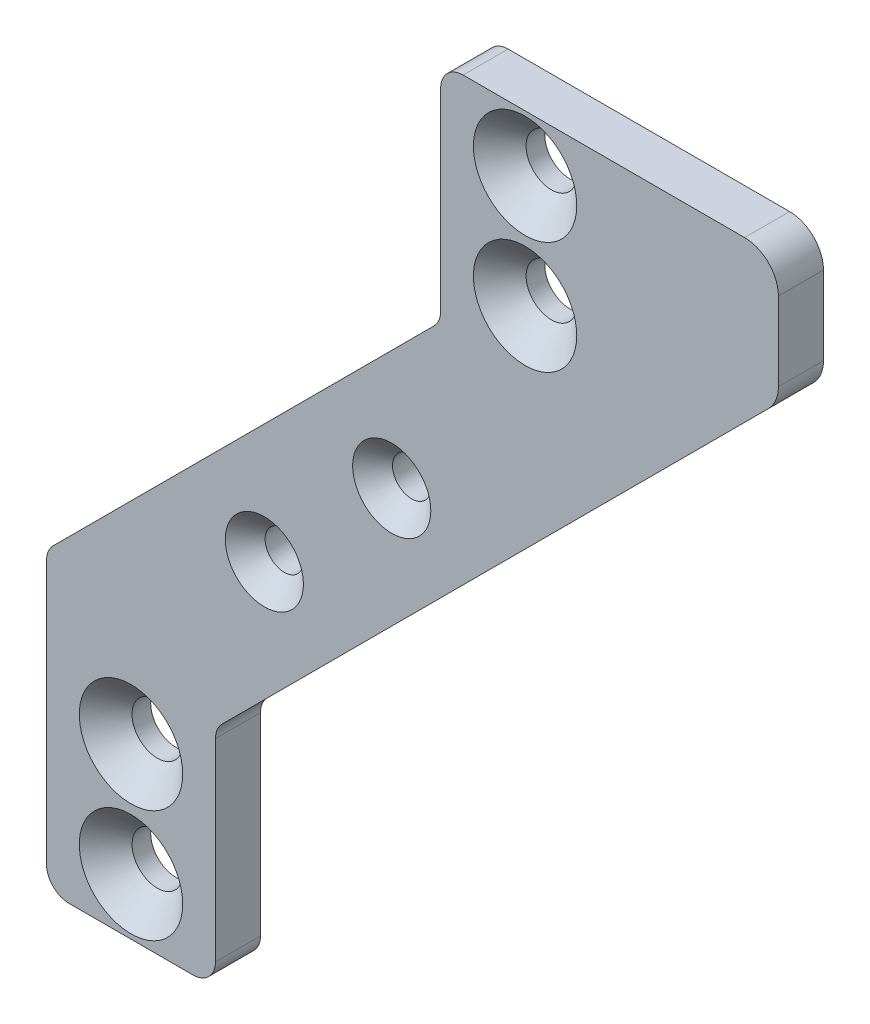
ISO-10303-21;
HEADER;
FILE_DESCRIPTION(('STEP AP214'),'2;1');
FILE_NAME('part.step','',(''),(''),'','','');
FILE_SCHEMA(('AUTOMOTIVE_DESIGN { 1 0 10303 214 1 1 1 1 }'));
ENDSEC;
DATA;
#1=APPLICATION_CONTEXT('core data for automotive mechanical design processes');
#2=APPLICATION_PROTOCOL_DEFINITION('international standard','automotive_design',2000,#1);
#3=PRODUCT_CONTEXT('',#1,'mechanical');
#4=PRODUCT('Part','Part','',(#3));
#5=PRODUCT_RELATED_PRODUCT_CATEGORY('part','',(#4));
#6=PRODUCT_DEFINITION_FORMATION('','',#4);
#7=PRODUCT_DEFINITION_CONTEXT('part definition',#1,'design');
#8=PRODUCT_DEFINITION('design','',#6,#7);
#9=PRODUCT_DEFINITION_SHAPE('','',#8);
#10=(LENGTH_UNIT() NAMED_UNIT(*) SI_UNIT(.MILLI.,.METRE.));
#11=(NAMED_UNIT(*) PLANE_ANGLE_UNIT() SI_UNIT($,.RADIAN.));
#12=(NAMED_UNIT(*) SI_UNIT($,.STERADIAN.) SOLID_ANGLE_UNIT());
#13=UNCERTAINTY_MEASURE_WITH_UNIT(LENGTH_MEASURE(1.E-05),#10,'distance_accuracy_value','');
#14=(GEOMETRIC_REPRESENTATION_CONTEXT(3) GLOBAL_UNCERTAINTY_ASSIGNED_CONTEXT((#13)) GLOBAL_UNIT_ASSIGNED_CONTEXT((#10,
#11,#12)) REPRESENTATION_CONTEXT('',''));
#15=CARTESIAN_POINT('',(0.,0.,0.));
#16=DIRECTION('',(0.,0.,1.));
#17=DIRECTION('',(1.,0.,0.));
#18=AXIS2_PLACEMENT_3D('',#15,#16,#17);
#19=CARTESIAN_POINT('',(0.,0.,4.));
#20=DIRECTION('',(0.,0.,-1.));
#21=DIRECTION('',(-1.,0.,0.));
#22=AXIS2_PLACEMENT_3D('',#19,#20,#21);
#23=PLANE('',#22);
#24=CARTESIAN_POINT('',(4.34314575050763,34.9497474683056,4.));
#25=DIRECTION('',(0.,0.,1.));
#26=DIRECTION('',(1.,0.,0.));
#27=AXIS2_PLACEMENT_3D('',#24,#25,#26);
#28=CIRCLE('',#27,3.47);
#29=CARTESIAN_POINT('',(7.81314575050763,34.9497474683056,4.));
#30=VERTEX_POINT('',#29);
#31=EDGE_CURVE('E303',#30,#30,#28,.T.);
#32=ORIENTED_EDGE('',*,*,#31,.F.);
#33=EDGE_LOOP('',(#32));
#34=FACE_BOUND('',#33,.T.);
#35=CARTESIAN_POINT('',(15.6568542494924,46.2634559672903,4.));
#36=DIRECTION('',(0.,0.,1.));
#37=DIRECTION('',(1.,0.,0.));
#38=AXIS2_PLACEMENT_3D('',#35,#36,#37);
#39=CIRCLE('',#38,3.47);
#40=CARTESIAN_POINT('',(19.1268542494924,46.2634559672903,4.));
#41=VERTEX_POINT('',#40);
#42=EDGE_CURVE('E269',#41,#41,#39,.T.);
#43=ORIENTED_EDGE('',*,*,#42,.F.);
#44=EDGE_LOOP('',(#43));
#45=FACE_BOUND('',#44,.T.);
#46=CARTESIAN_POINT('',(27.5,76.2132034355959,4.));
#47=DIRECTION('',(0.,0.,1.));
#48=DIRECTION('',(1.,0.,0.));
#49=AXIS2_PLACEMENT_3D('',#46,#47,#48);
#50=CIRCLE('',#49,4.59);
#51=CARTESIAN_POINT('',(32.09,76.2132034355959,4.));
#52=VERTEX_POINT('',#51);
#53=EDGE_CURVE('E264',#52,#52,#50,.T.);
#54=ORIENTED_EDGE('',*,*,#53,.F.);
#55=EDGE_LOOP('',(#54));
#56=FACE_BOUND('',#55,.T.);
#57=CARTESIAN_POINT('',(27.5,66.2132034355959,4.));
#58=DIRECTION('',(0.,0.,1.));
#59=DIRECTION('',(1.,0.,0.));
#60=AXIS2_PLACEMENT_3D('',#57,#58,#59);
#61=CIRCLE('',#60,4.59);
#62=CARTESIAN_POINT('',(32.09,66.2132034355959,4.));
#63=VERTEX_POINT('',#62);
#64=EDGE_CURVE('E259',#63,#63,#61,.T.);
#65=ORIENTED_EDGE('',*,*,#64,.F.);
#66=EDGE_LOOP('',(#65));
#67=FACE_BOUND('',#66,.T.);
#68=CARTESIAN_POINT('',(-7.5,15.,4.));
#69=DIRECTION('',(0.,0.,1.));
#70=DIRECTION('',(1.,0.,0.));
#71=AXIS2_PLACEMENT_3D('',#68,#69,#70);
#72=CIRCLE('',#71,4.59);
#73=CARTESIAN_POINT('',(-2.91,15.,4.));
#74=VERTEX_POINT('',#73);
#75=EDGE_CURVE('E254',#74,#74,#72,.T.);
#76=ORIENTED_EDGE('',*,*,#75,.F.);
#77=EDGE_LOOP('',(#76));
#78=FACE_BOUND('',#77,.T.);
#79=DIRECTION('',(0.707106781186559,0.707106781186536,0.));
#80=VECTOR('',#79,1.);
#81=CARTESIAN_POINT('',(35.,54.9999999999988,4.));
#82=LINE('',#81,#80);
#83=CARTESIAN_POINT('',(0.585786437626926,20.5857864376269,4.));
#84=VERTEX_POINT('',#83);
#85=CARTESIAN_POINT('',(49.1213203435596,69.121320343558,4.));
#86=VERTEX_POINT('',#85);
#87=EDGE_CURVE('E298',#84,#86,#82,.T.);
#88=ORIENTED_EDGE('',*,*,#87,.T.);
#89=CARTESIAN_POINT('',(47.,71.2426406871177,4.));
#90=DIRECTION('',(0.,0.,-1.));
#91=DIRECTION('',(-1.,0.,0.));
#92=AXIS2_PLACEMENT_3D('',#89,#90,#91);
#93=CIRCLE('',#92,3.);
#94=CARTESIAN_POINT('',(50.,71.2426406871177,4.));
#95=VERTEX_POINT('',#94);
#96=EDGE_CURVE('E275',#86,#95,#93,.F.);
#97=ORIENTED_EDGE('',*,*,#96,.T.);
#98=DIRECTION('',(0.,1.,0.));
#99=VECTOR('',#98,1.);
#100=CARTESIAN_POINT('',(50.,69.9999999999994,4.));
#101=LINE('',#100,#99);
#102=CARTESIAN_POINT('',(50.,78.2132034355953,4.));
#103=VERTEX_POINT('',#102);
#104=EDGE_CURVE('E297',#95,#103,#101,.T.);
#105=ORIENTED_EDGE('',*,*,#104,.T.);
#106=CARTESIAN_POINT('',(47.,78.2132034355953,4.));
#107=DIRECTION('',(0.,0.,-1.));
#108=DIRECTION('',(-1.,0.,0.));
#109=AXIS2_PLACEMENT_3D('',#106,#107,#108);
#110=CIRCLE('',#109,3.);
#111=CARTESIAN_POINT('',(47.,81.2132034355953,4.));
#112=VERTEX_POINT('',#111);
#113=EDGE_CURVE('E273',#103,#112,#110,.F.);
#114=ORIENTED_EDGE('',*,*,#113,.T.);
#115=DIRECTION('',(-1.,0.,0.));
#116=VECTOR('',#115,1.);
#117=CARTESIAN_POINT('',(20.,81.2132034355953,4.));
#118=LINE('',#117,#116);
#119=CARTESIAN_POINT('',(22.,81.2132034355953,4.));
#120=VERTEX_POINT('',#119);
#121=EDGE_CURVE('E332',#112,#120,#118,.T.);
#122=ORIENTED_EDGE('',*,*,#121,.T.);
#123=CARTESIAN_POINT('',(22.,79.2132034355953,4.));
#124=DIRECTION('',(0.,0.,-1.));
#125=DIRECTION('',(-1.,0.,0.));
#126=AXIS2_PLACEMENT_3D('',#123,#124,#125);
#127=CIRCLE('',#126,2.);
#128=CARTESIAN_POINT('',(20.,79.2132034355953,4.));
#129=VERTEX_POINT('',#128);
#130=EDGE_CURVE('E209',#120,#129,#127,.F.);
#131=ORIENTED_EDGE('',*,*,#130,.T.);
#132=DIRECTION('',(0.,-1.,0.));
#133=VECTOR('',#132,1.);
#134=CARTESIAN_POINT('',(20.,61.2132034355953,4.));
#135=LINE('',#134,#133);
#136=CARTESIAN_POINT('',(20.,62.0416305603415,4.));
#137=VERTEX_POINT('',#136);
#138=EDGE_CURVE('E334',#129,#137,#135,.T.);
#139=ORIENTED_EDGE('',*,*,#138,.T.);
#140=CARTESIAN_POINT('',(18.,62.0416305603415,4.));
#141=DIRECTION('',(0.,0.,-1.));
#142=DIRECTION('',(-1.,0.,0.));
#143=AXIS2_PLACEMENT_3D('',#140,#141,#142);
#144=CIRCLE('',#143,2.);
#145=CARTESIAN_POINT('',(19.4142135623731,60.6274169979684,4.));
#146=VERTEX_POINT('',#145);
#147=EDGE_CURVE('E240',#137,#146,#144,.T.);
#148=ORIENTED_EDGE('',*,*,#147,.T.);
#149=DIRECTION('',(-0.707106781186549,-0.707106781186546,0.));
#150=VECTOR('',#149,1.);
#151=CARTESIAN_POINT('',(-15.,26.2132034355954,4.));
#152=LINE('',#151,#150);
#153=CARTESIAN_POINT('',(-14.4142135623731,26.7989898732223,4.));
#154=VERTEX_POINT('',#153);
#155=EDGE_CURVE('E337',#146,#154,#152,.T.);
#156=ORIENTED_EDGE('',*,*,#155,.T.);
#157=CARTESIAN_POINT('',(-13.,25.3847763108492,4.));
#158=DIRECTION('',(0.,0.,-1.));
#159=DIRECTION('',(-1.,0.,0.));
#160=AXIS2_PLACEMENT_3D('',#157,#158,#159);
#161=CIRCLE('',#160,2.);
#162=CARTESIAN_POINT('',(-15.,25.3847763108492,4.));
#163=VERTEX_POINT('',#162);
#164=EDGE_CURVE('E211',#154,#163,#161,.F.);
#165=ORIENTED_EDGE('',*,*,#164,.T.);
#166=DIRECTION('',(0.,-1.,0.));
#167=VECTOR('',#166,1.);
#168=CARTESIAN_POINT('',(-15.,0.,4.));
#169=LINE('',#168,#167);
#170=CARTESIAN_POINT('',(-15.,2.,4.));
#171=VERTEX_POINT('',#170);
#172=EDGE_CURVE('E339',#163,#171,#169,.T.);
#173=ORIENTED_EDGE('',*,*,#172,.T.);
#174=CARTESIAN_POINT('',(-13.,2.,4.));
#175=DIRECTION('',(0.,0.,-1.));
#176=DIRECTION('',(-1.,0.,0.));
#177=AXIS2_PLACEMENT_3D('',#174,#175,#176);
#178=CIRCLE('',#177,2.);
#179=CARTESIAN_POINT('',(-13.,0.,4.));
#180=VERTEX_POINT('',#179);
#181=EDGE_CURVE('E213',#171,#180,#178,.F.);
#182=ORIENTED_EDGE('',*,*,#181,.T.);
#183=DIRECTION('',(1.,0.,0.));
#184=VECTOR('',#183,1.);
#185=CARTESIAN_POINT('',(0.,0.,4.));
#186=LINE('',#185,#184);
#187=CARTESIAN_POINT('',(-2.,0.,4.));
#188=VERTEX_POINT('',#187);
#189=EDGE_CURVE('E185',#180,#188,#186,.T.);
#190=ORIENTED_EDGE('',*,*,#189,.T.);
#191=CARTESIAN_POINT('',(-2.,2.,4.));
#192=DIRECTION('',(0.,0.,-1.));
#193=DIRECTION('',(-1.,0.,0.));
#194=AXIS2_PLACEMENT_3D('',#191,#192,#193);
#195=CIRCLE('',#194,2.);
#196=CARTESIAN_POINT('',(0.,2.,4.));
#197=VERTEX_POINT('',#196);
#198=EDGE_CURVE('E215',#188,#197,#195,.F.);
#199=ORIENTED_EDGE('',*,*,#198,.T.);
#200=DIRECTION('',(0.,1.,0.));
#201=VECTOR('',#200,1.);
#202=CARTESIAN_POINT('',(0.,20.,4.));
#203=LINE('',#202,#201);
#204=CARTESIAN_POINT('',(0.,19.1715728752538,4.));
#205=VERTEX_POINT('',#204);
#206=EDGE_CURVE('E167',#197,#205,#203,.T.);
#207=ORIENTED_EDGE('',*,*,#206,.T.);
#208=CARTESIAN_POINT('',(2.,19.1715728752538,4.));
#209=DIRECTION('',(0.,0.,-1.));
#210=DIRECTION('',(-1.,0.,0.));
#211=AXIS2_PLACEMENT_3D('',#208,#209,#210);
#212=CIRCLE('',#211,2.);
#213=EDGE_CURVE('E243',#205,#84,#212,.T.);
#214=ORIENTED_EDGE('',*,*,#213,.T.);
#215=EDGE_LOOP('',(#88,#97,#105,#114,#122,#131,#139,#148,#156,#165,#173,#182,#190,#199,#207,#214));
#216=FACE_BOUND('',#215,.T.);
#217=CARTESIAN_POINT('',(-7.5,5.,4.));
#218=DIRECTION('',(0.,0.,1.));
#219=DIRECTION('',(1.,0.,0.));
#220=AXIS2_PLACEMENT_3D('',#217,#218,#219);
#221=CIRCLE('',#220,4.59);
#222=CARTESIAN_POINT('',(-2.91,5.,4.));
#223=VERTEX_POINT('',#222);
#224=EDGE_CURVE('E249',#223,#223,#221,.T.);
#225=ORIENTED_EDGE('',*,*,#224,.F.);
#226=EDGE_LOOP('',(#225));
#227=FACE_BOUND('',#226,.T.);
#228=ADVANCED_FACE('F35',(#34,#45,#56,#67,#78,#216,#227),#23,.F.);
#229=CARTESIAN_POINT('',(0.,20.,4.));
#230=DIRECTION('',(-1.,0.,0.));
#231=DIRECTION('',(0.,-1.,0.));
#232=AXIS2_PLACEMENT_3D('',#229,#230,#231);
#233=PLANE('',#232);
#234=ORIENTED_EDGE('',*,*,#206,.F.);
#235=DIRECTION('',(0.,0.,-1.));
#236=VECTOR('',#235,1.);
#237=CARTESIAN_POINT('',(0.,2.,4.));
#238=LINE('',#237,#236);
#239=CARTESIAN_POINT('',(0.,2.,0.));
#240=VERTEX_POINT('',#239);
#241=EDGE_CURVE('E152',#197,#240,#238,.T.);
#242=ORIENTED_EDGE('',*,*,#241,.T.);
#243=DIRECTION('',(0.,1.,0.));
#244=VECTOR('',#243,1.);
#245=CARTESIAN_POINT('',(0.,20.,0.));
#246=LINE('',#245,#244);
#247=CARTESIAN_POINT('',(0.,19.1715728752538,0.));
#248=VERTEX_POINT('',#247);
#249=EDGE_CURVE('E164',#240,#248,#246,.T.);
#250=ORIENTED_EDGE('',*,*,#249,.T.);
#251=DIRECTION('',(0.,0.,-1.));
#252=VECTOR('',#251,1.);
#253=CARTESIAN_POINT('',(0.,19.1715728752538,4.));
#254=LINE('',#253,#252);
#255=EDGE_CURVE('E169',#248,#205,#254,.F.);
#256=ORIENTED_EDGE('',*,*,#255,.T.);
#257=EDGE_LOOP('',(#234,#242,#250,#256));
#258=FACE_BOUND('',#257,.T.);
#259=ADVANCED_FACE('F163',(#258),#233,.F.);
#260=CARTESIAN_POINT('',(35.,54.9999999999988,4.));
#261=DIRECTION('',(-0.707106781186536,0.707106781186559,0.));
#262=DIRECTION('',(-0.707106781186559,-0.707106781186536,0.));
#263=AXIS2_PLACEMENT_3D('',#260,#261,#262);
#264=PLANE('',#263);
#265=DIRECTION('',(0.707106781186559,0.707106781186536,0.));
#266=VECTOR('',#265,1.);
#267=CARTESIAN_POINT('',(35.,54.9999999999988,0.));
#268=LINE('',#267,#266);
#269=CARTESIAN_POINT('',(0.585786437626926,20.5857864376269,0.));
#270=VERTEX_POINT('',#269);
#271=CARTESIAN_POINT('',(49.1213203435596,69.121320343558,0.));
#272=VERTEX_POINT('',#271);
#273=EDGE_CURVE('E175',#270,#272,#268,.T.);
#274=ORIENTED_EDGE('',*,*,#273,.T.);
#275=DIRECTION('',(0.,0.,1.));
#276=VECTOR('',#275,1.);
#277=CARTESIAN_POINT('',(49.1213203435596,69.121320343558,4.));
#278=LINE('',#277,#276);
#279=EDGE_CURVE('E244',#272,#86,#278,.T.);
#280=ORIENTED_EDGE('',*,*,#279,.T.);
#281=ORIENTED_EDGE('',*,*,#87,.F.);
#282=DIRECTION('',(0.,0.,-1.));
#283=VECTOR('',#282,1.);
#284=CARTESIAN_POINT('',(0.58578643762693,20.5857864376269,0.));
#285=LINE('',#284,#283);
#286=EDGE_CURVE('E235',#84,#270,#285,.T.);
#287=ORIENTED_EDGE('',*,*,#286,.T.);
#288=EDGE_LOOP('',(#274,#280,#281,#287));
#289=FACE_BOUND('',#288,.T.);
#290=ADVANCED_FACE('F288',(#289),#264,.F.);
#291=CARTESIAN_POINT('',(20.,81.2132034355953,4.));
#292=DIRECTION('',(0.,-1.,0.));
#293=DIRECTION('',(1.,0.,0.));
#294=AXIS2_PLACEMENT_3D('',#291,#292,#293);
#295=PLANE('',#294);
#296=ORIENTED_EDGE('',*,*,#121,.F.);
#297=DIRECTION('',(0.,0.,1.));
#298=VECTOR('',#297,1.);
#299=CARTESIAN_POINT('',(47.,81.2132034355953,0.));
#300=LINE('',#299,#298);
#301=CARTESIAN_POINT('',(47.,81.2132034355953,0.));
#302=VERTEX_POINT('',#301);
#303=EDGE_CURVE('E11',#112,#302,#300,.F.);
#304=ORIENTED_EDGE('',*,*,#303,.T.);
#305=DIRECTION('',(-1.,0.,0.));
#306=VECTOR('',#305,1.);
#307=CARTESIAN_POINT('',(20.,81.2132034355953,0.));
#308=LINE('',#307,#306);
#309=CARTESIAN_POINT('',(22.,81.2132034355953,0.));
#310=VERTEX_POINT('',#309);
#311=EDGE_CURVE('E179',#302,#310,#308,.T.);
#312=ORIENTED_EDGE('',*,*,#311,.T.);
#313=DIRECTION('',(0.,0.,-1.));
#314=VECTOR('',#313,1.);
#315=CARTESIAN_POINT('',(22.,81.2132034355953,4.));
#316=LINE('',#315,#314);
#317=EDGE_CURVE('E232',#310,#120,#316,.F.);
#318=ORIENTED_EDGE('',*,*,#317,.T.);
#319=EDGE_LOOP('',(#296,#304,#312,#318));
#320=FACE_BOUND('',#319,.T.);
#321=ADVANCED_FACE('F378',(#320),#295,.F.);
#322=CARTESIAN_POINT('',(20.,61.2132034355953,4.));
#323=DIRECTION('',(1.,0.,0.));
#324=DIRECTION('',(0.,0.,-1.));
#325=AXIS2_PLACEMENT_3D('',#322,#323,#324);
#326=PLANE('',#325);
#327=DIRECTION('',(0.,-1.,0.));
#328=VECTOR('',#327,1.);
#329=CARTESIAN_POINT('',(20.,61.2132034355953,0.));
#330=LINE('',#329,#328);
#331=CARTESIAN_POINT('',(20.,79.2132034355953,0.));
#332=VERTEX_POINT('',#331);
#333=CARTESIAN_POINT('',(20.,62.0416305603415,0.));
#334=VERTEX_POINT('',#333);
#335=EDGE_CURVE('E189',#332,#334,#330,.T.);
#336=ORIENTED_EDGE('',*,*,#335,.T.);
#337=DIRECTION('',(0.,0.,-1.));
#338=VECTOR('',#337,1.);
#339=CARTESIAN_POINT('',(20.,62.0416305603415,4.));
#340=LINE('',#339,#338);
#341=EDGE_CURVE('E230',#334,#137,#340,.F.);
#342=ORIENTED_EDGE('',*,*,#341,.T.);
#343=ORIENTED_EDGE('',*,*,#138,.F.);
#344=DIRECTION('',(0.,0.,-1.));
#345=VECTOR('',#344,1.);
#346=CARTESIAN_POINT('',(20.,79.2132034355953,4.));
#347=LINE('',#346,#345);
#348=EDGE_CURVE('E227',#129,#332,#347,.T.);
#349=ORIENTED_EDGE('',*,*,#348,.T.);
#350=EDGE_LOOP('',(#336,#342,#343,#349));
#351=FACE_BOUND('',#350,.T.);
#352=ADVANCED_FACE('F370',(#351),#326,.F.);
#353=CARTESIAN_POINT('',(-15.,26.2132034355954,4.));
#354=DIRECTION('',(0.707106781186546,-0.707106781186549,0.));
#355=DIRECTION('',(0.707106781186549,0.707106781186546,0.));
#356=AXIS2_PLACEMENT_3D('',#353,#354,#355);
#357=PLANE('',#356);
#358=DIRECTION('',(-0.707106781186549,-0.707106781186546,0.));
#359=VECTOR('',#358,1.);
#360=CARTESIAN_POINT('',(-15.,26.2132034355954,0.));
#361=LINE('',#360,#359);
#362=CARTESIAN_POINT('',(19.4142135623731,60.6274169979684,0.));
#363=VERTEX_POINT('',#362);
#364=CARTESIAN_POINT('',(-14.4142135623731,26.7989898732223,0.));
#365=VERTEX_POINT('',#364);
#366=EDGE_CURVE('E192',#363,#365,#361,.T.);
#367=ORIENTED_EDGE('',*,*,#366,.T.);
#368=DIRECTION('',(0.,0.,-1.));
#369=VECTOR('',#368,1.);
#370=CARTESIAN_POINT('',(-14.4142135623731,26.7989898732223,4.));
#371=LINE('',#370,#369);
#372=EDGE_CURVE('E225',#365,#154,#371,.F.);
#373=ORIENTED_EDGE('',*,*,#372,.T.);
#374=ORIENTED_EDGE('',*,*,#155,.F.);
#375=DIRECTION('',(0.,0.,-1.));
#376=VECTOR('',#375,1.);
#377=CARTESIAN_POINT('',(19.4142135623731,60.6274169979684,0.));
#378=LINE('',#377,#376);
#379=EDGE_CURVE('E222',#146,#363,#378,.T.);
#380=ORIENTED_EDGE('',*,*,#379,.T.);
#381=EDGE_LOOP('',(#367,#373,#374,#380));
#382=FACE_BOUND('',#381,.T.);
#383=ADVANCED_FACE('F361',(#382),#357,.F.);
#384=CARTESIAN_POINT('',(-15.,0.,4.));
#385=DIRECTION('',(1.,0.,0.));
#386=DIRECTION('',(0.,0.,-1.));
#387=AXIS2_PLACEMENT_3D('',#384,#385,#386);
#388=PLANE('',#387);
#389=DIRECTION('',(0.,-1.,0.));
#390=VECTOR('',#389,1.);
#391=CARTESIAN_POINT('',(-15.,0.,0.));
#392=LINE('',#391,#390);
#393=CARTESIAN_POINT('',(-15.,25.3847763108492,0.));
#394=VERTEX_POINT('',#393);
#395=CARTESIAN_POINT('',(-15.,2.,0.));
#396=VERTEX_POINT('',#395);
#397=EDGE_CURVE('E195',#394,#396,#392,.T.);
#398=ORIENTED_EDGE('',*,*,#397,.T.);
#399=DIRECTION('',(0.,0.,-1.));
#400=VECTOR('',#399,1.);
#401=CARTESIAN_POINT('',(-15.,2.,4.));
#402=LINE('',#401,#400);
#403=EDGE_CURVE('E220',#396,#171,#402,.F.);
#404=ORIENTED_EDGE('',*,*,#403,.T.);
#405=ORIENTED_EDGE('',*,*,#172,.F.);
#406=DIRECTION('',(0.,0.,-1.));
#407=VECTOR('',#406,1.);
#408=CARTESIAN_POINT('',(-15.,25.3847763108492,4.));
#409=LINE('',#408,#407);
#410=EDGE_CURVE('E217',#163,#394,#409,.T.);
#411=ORIENTED_EDGE('',*,*,#410,.T.);
#412=EDGE_LOOP('',(#398,#404,#405,#411));
#413=FACE_BOUND('',#412,.T.);
#414=ADVANCED_FACE('F353',(#413),#388,.F.);
#415=CARTESIAN_POINT('',(0.,0.,4.));
#416=DIRECTION('',(0.,1.,0.));
#417=DIRECTION('',(0.,0.,1.));
#418=AXIS2_PLACEMENT_3D('',#415,#416,#417);
#419=PLANE('',#418);
#420=DIRECTION('',(1.,0.,0.));
#421=VECTOR('',#420,1.);
#422=CARTESIAN_POINT('',(0.,0.,0.));
#423=LINE('',#422,#421);
#424=CARTESIAN_POINT('',(-13.,0.,0.));
#425=VERTEX_POINT('',#424);
#426=CARTESIAN_POINT('',(-2.,0.,0.));
#427=VERTEX_POINT('',#426);
#428=EDGE_CURVE('E198',#425,#427,#423,.T.);
#429=ORIENTED_EDGE('',*,*,#428,.T.);
#430=DIRECTION('',(0.,0.,-1.));
#431=VECTOR('',#430,1.);
#432=CARTESIAN_POINT('',(-2.,0.,4.));
#433=LINE('',#432,#431);
#434=EDGE_CURVE('E153',#427,#188,#433,.F.);
#435=ORIENTED_EDGE('',*,*,#434,.T.);
#436=ORIENTED_EDGE('',*,*,#189,.F.);
#437=DIRECTION('',(0.,0.,-1.));
#438=VECTOR('',#437,1.);
#439=CARTESIAN_POINT('',(-13.,0.,4.));
#440=LINE('',#439,#438);
#441=EDGE_CURVE('E157',#180,#425,#440,.T.);
#442=ORIENTED_EDGE('',*,*,#441,.T.);
#443=EDGE_LOOP('',(#429,#435,#436,#442));
#444=FACE_BOUND('',#443,.T.);
#445=ADVANCED_FACE('F347',(#444),#419,.F.);
#446=CARTESIAN_POINT('',(0.,0.,0.));
#447=DIRECTION('',(0.,0.,-1.));
#448=DIRECTION('',(-1.,0.,0.));
#449=AXIS2_PLACEMENT_3D('',#446,#447,#448);
#450=PLANE('',#449);
#451=DIRECTION('',(0.,1.,0.));
#452=VECTOR('',#451,1.);
#453=CARTESIAN_POINT('',(50.,69.9999999999994,0.));
#454=LINE('',#453,#452);
#455=CARTESIAN_POINT('',(50.,71.2426406871177,0.));
#456=VERTEX_POINT('',#455);
#457=CARTESIAN_POINT('',(50.,78.2132034355953,0.));
#458=VERTEX_POINT('',#457);
#459=EDGE_CURVE('E283',#456,#458,#454,.T.);
#460=ORIENTED_EDGE('',*,*,#459,.F.);
#461=CARTESIAN_POINT('',(47.,71.2426406871177,0.));
#462=DIRECTION('',(0.,0.,-1.));
#463=DIRECTION('',(-1.,0.,0.));
#464=AXIS2_PLACEMENT_3D('',#461,#462,#463);
#465=CIRCLE('',#464,3.);
#466=EDGE_CURVE('E43',#456,#272,#465,.T.);
#467=ORIENTED_EDGE('',*,*,#466,.T.);
#468=ORIENTED_EDGE('',*,*,#273,.F.);
#469=CARTESIAN_POINT('',(2.,19.1715728752538,0.));
#470=DIRECTION('',(0.,0.,-1.));
#471=DIRECTION('',(-1.,0.,0.));
#472=AXIS2_PLACEMENT_3D('',#469,#470,#471);
#473=CIRCLE('',#472,2.);
#474=EDGE_CURVE('E174',#270,#248,#473,.F.);
#475=ORIENTED_EDGE('',*,*,#474,.T.);
#476=ORIENTED_EDGE('',*,*,#249,.F.);
#477=CARTESIAN_POINT('',(-2.,2.,0.));
#478=DIRECTION('',(0.,0.,-1.));
#479=DIRECTION('',(-1.,0.,0.));
#480=AXIS2_PLACEMENT_3D('',#477,#478,#479);
#481=CIRCLE('',#480,2.);
#482=EDGE_CURVE('E148',#240,#427,#481,.T.);
#483=ORIENTED_EDGE('',*,*,#482,.T.);
#484=ORIENTED_EDGE('',*,*,#428,.F.);
#485=CARTESIAN_POINT('',(-13.,2.,0.));
#486=DIRECTION('',(0.,0.,-1.));
#487=DIRECTION('',(-1.,0.,0.));
#488=AXIS2_PLACEMENT_3D('',#485,#486,#487);
#489=CIRCLE('',#488,2.);
#490=EDGE_CURVE('E158',#425,#396,#489,.T.);
#491=ORIENTED_EDGE('',*,*,#490,.T.);
#492=ORIENTED_EDGE('',*,*,#397,.F.);
#493=CARTESIAN_POINT('',(-13.,25.3847763108492,0.));
#494=DIRECTION('',(0.,0.,-1.));
#495=DIRECTION('',(-1.,0.,0.));
#496=AXIS2_PLACEMENT_3D('',#493,#494,#495);
#497=CIRCLE('',#496,2.);
#498=EDGE_CURVE('E203',#394,#365,#497,.T.);
#499=ORIENTED_EDGE('',*,*,#498,.T.);
#500=ORIENTED_EDGE('',*,*,#366,.F.);
#501=CARTESIAN_POINT('',(18.,62.0416305603415,0.));
#502=DIRECTION('',(0.,0.,-1.));
#503=DIRECTION('',(-1.,0.,0.));
#504=AXIS2_PLACEMENT_3D('',#501,#502,#503);
#505=CIRCLE('',#504,2.);
#506=EDGE_CURVE('E238',#363,#334,#505,.F.);
#507=ORIENTED_EDGE('',*,*,#506,.T.);
#508=ORIENTED_EDGE('',*,*,#335,.F.);
#509=CARTESIAN_POINT('',(22.,79.2132034355953,0.));
#510=DIRECTION('',(0.,0.,-1.));
#511=DIRECTION('',(-1.,0.,0.));
#512=AXIS2_PLACEMENT_3D('',#509,#510,#511);
#513=CIRCLE('',#512,2.);
#514=EDGE_CURVE('E168',#332,#310,#513,.T.);
#515=ORIENTED_EDGE('',*,*,#514,.T.);
#516=ORIENTED_EDGE('',*,*,#311,.F.);
#517=CARTESIAN_POINT('',(47.,78.2132034355953,0.));
#518=DIRECTION('',(0.,0.,-1.));
#519=DIRECTION('',(-1.,0.,0.));
#520=AXIS2_PLACEMENT_3D('',#517,#518,#519);
#521=CIRCLE('',#520,3.);
#522=EDGE_CURVE('E55',#302,#458,#521,.T.);
#523=ORIENTED_EDGE('',*,*,#522,.T.);
#524=EDGE_LOOP('',(#460,#467,#468,#475,#476,#483,#484,#491,#492,#499,#500,#507,#508,#515,#516,#523));
#525=FACE_BOUND('',#524,.T.);
#526=CARTESIAN_POINT('',(4.34314575050763,34.9497474683056,0.));
#527=DIRECTION('',(0.,0.,-1.));
#528=DIRECTION('',(-1.,0.,0.));
#529=AXIS2_PLACEMENT_3D('',#526,#527,#528);
#530=CIRCLE('',#529,1.7);
#531=CARTESIAN_POINT('',(2.64314575050763,34.9497474683056,0.));
#532=VERTEX_POINT('',#531);
#533=EDGE_CURVE('E266',#532,#532,#530,.T.);
#534=ORIENTED_EDGE('',*,*,#533,.F.);
#535=EDGE_LOOP('',(#534));
#536=FACE_BOUND('',#535,.T.);
#537=CARTESIAN_POINT('',(15.6568542494924,46.2634559672903,0.));
#538=DIRECTION('',(0.,0.,-1.));
#539=DIRECTION('',(-1.,0.,0.));
#540=AXIS2_PLACEMENT_3D('',#537,#538,#539);
#541=CIRCLE('',#540,1.69999999999999);
#542=CARTESIAN_POINT('',(13.9568542494924,46.2634559672903,0.));
#543=VERTEX_POINT('',#542);
#544=EDGE_CURVE('E261',#543,#543,#541,.T.);
#545=ORIENTED_EDGE('',*,*,#544,.F.);
#546=EDGE_LOOP('',(#545));
#547=FACE_BOUND('',#546,.T.);
#548=CARTESIAN_POINT('',(27.5,76.2132034355959,0.));
#549=DIRECTION('',(0.,0.,-1.));
#550=DIRECTION('',(-1.,0.,0.));
#551=AXIS2_PLACEMENT_3D('',#548,#549,#550);
#552=CIRCLE('',#551,2.24999999999999);
#553=CARTESIAN_POINT('',(25.25,76.2132034355959,0.));
#554=VERTEX_POINT('',#553);
#555=EDGE_CURVE('E256',#554,#554,#552,.T.);
#556=ORIENTED_EDGE('',*,*,#555,.F.);
#557=EDGE_LOOP('',(#556));
#558=FACE_BOUND('',#557,.T.);
#559=CARTESIAN_POINT('',(27.5,66.2132034355959,0.));
#560=DIRECTION('',(0.,0.,-1.));
#561=DIRECTION('',(-1.,0.,0.));
#562=AXIS2_PLACEMENT_3D('',#559,#560,#561);
#563=CIRCLE('',#562,2.24999999999999);
#564=CARTESIAN_POINT('',(25.25,66.2132034355959,0.));
#565=VERTEX_POINT('',#564);
#566=EDGE_CURVE('E251',#565,#565,#563,.T.);
#567=ORIENTED_EDGE('',*,*,#566,.F.);
#568=EDGE_LOOP('',(#567));
#569=FACE_BOUND('',#568,.T.);
#570=CARTESIAN_POINT('',(-7.5,15.,0.));
#571=DIRECTION('',(0.,0.,-1.));
#572=DIRECTION('',(-1.,0.,0.));
#573=AXIS2_PLACEMENT_3D('',#570,#571,#572);
#574=CIRCLE('',#573,2.24999999999999);
#575=CARTESIAN_POINT('',(-9.74999999999999,15.,0.));
#576=VERTEX_POINT('',#575);
#577=EDGE_CURVE('E246',#576,#576,#574,.T.);
#578=ORIENTED_EDGE('',*,*,#577,.F.);
#579=EDGE_LOOP('',(#578));
#580=FACE_BOUND('',#579,.T.);
#581=CARTESIAN_POINT('',(-7.5,5.,0.));
#582=DIRECTION('',(0.,0.,-1.));
#583=DIRECTION('',(-1.,0.,0.));
#584=AXIS2_PLACEMENT_3D('',#581,#582,#583);
#585=CIRCLE('',#584,2.24999999999999);
#586=CARTESIAN_POINT('',(-9.74999999999999,5.,0.));
#587=VERTEX_POINT('',#586);
#588=EDGE_CURVE('E176',#587,#587,#585,.T.);
#589=ORIENTED_EDGE('',*,*,#588,.F.);
#590=EDGE_LOOP('',(#589));
#591=FACE_BOUND('',#590,.T.);
#592=ADVANCED_FACE('F171',(#525,#536,#547,#558,#569,#580,#591),#450,.T.);
#593=CARTESIAN_POINT('',(-2.,2.,4.));
#594=DIRECTION('',(0.,0.,-1.));
#595=DIRECTION('',(-1.,0.,0.));
#596=AXIS2_PLACEMENT_3D('',#593,#594,#595);
#597=CYLINDRICAL_SURFACE('',#596,2.);
#598=ORIENTED_EDGE('',*,*,#198,.F.);
#599=ORIENTED_EDGE('',*,*,#434,.F.);
#600=ORIENTED_EDGE('',*,*,#482,.F.);
#601=ORIENTED_EDGE('',*,*,#241,.F.);
#602=EDGE_LOOP('',(#598,#599,#600,#601));
#603=FACE_BOUND('',#602,.T.);
#604=ADVANCED_FACE('F151',(#603),#597,.T.);
#605=CARTESIAN_POINT('',(-13.,2.,4.));
#606=DIRECTION('',(0.,0.,-1.));
#607=DIRECTION('',(-1.,0.,0.));
#608=AXIS2_PLACEMENT_3D('',#605,#606,#607);
#609=CYLINDRICAL_SURFACE('',#608,2.);
#610=ORIENTED_EDGE('',*,*,#181,.F.);
#611=ORIENTED_EDGE('',*,*,#403,.F.);
#612=ORIENTED_EDGE('',*,*,#490,.F.);
#613=ORIENTED_EDGE('',*,*,#441,.F.);
#614=EDGE_LOOP('',(#610,#611,#612,#613));
#615=FACE_BOUND('',#614,.T.);
#616=ADVANCED_FACE('F349',(#615),#609,.T.);
#617=CARTESIAN_POINT('',(-13.,25.3847763108492,4.));
#618=DIRECTION('',(0.,0.,-1.));
#619=DIRECTION('',(-1.,0.,0.));
#620=AXIS2_PLACEMENT_3D('',#617,#618,#619);
#621=CYLINDRICAL_SURFACE('',#620,2.);
#622=ORIENTED_EDGE('',*,*,#164,.F.);
#623=ORIENTED_EDGE('',*,*,#372,.F.);
#624=ORIENTED_EDGE('',*,*,#498,.F.);
#625=ORIENTED_EDGE('',*,*,#410,.F.);
#626=EDGE_LOOP('',(#622,#623,#624,#625));
#627=FACE_BOUND('',#626,.T.);
#628=ADVANCED_FACE('F357',(#627),#621,.T.);
#629=CARTESIAN_POINT('',(18.,62.0416305603415,4.));
#630=DIRECTION('',(0.,0.,1.));
#631=DIRECTION('',(1.,0.,0.));
#632=AXIS2_PLACEMENT_3D('',#629,#630,#631);
#633=CYLINDRICAL_SURFACE('',#632,2.);
#634=ORIENTED_EDGE('',*,*,#147,.F.);
#635=ORIENTED_EDGE('',*,*,#341,.F.);
#636=ORIENTED_EDGE('',*,*,#506,.F.);
#637=ORIENTED_EDGE('',*,*,#379,.F.);
#638=EDGE_LOOP('',(#634,#635,#636,#637));
#639=FACE_BOUND('',#638,.T.);
#640=ADVANCED_FACE('F366',(#639),#633,.F.);
#641=CARTESIAN_POINT('',(22.,79.2132034355953,4.));
#642=DIRECTION('',(0.,0.,-1.));
#643=DIRECTION('',(-1.,0.,0.));
#644=AXIS2_PLACEMENT_3D('',#641,#642,#643);
#645=CYLINDRICAL_SURFACE('',#644,2.);
#646=ORIENTED_EDGE('',*,*,#130,.F.);
#647=ORIENTED_EDGE('',*,*,#317,.F.);
#648=ORIENTED_EDGE('',*,*,#514,.F.);
#649=ORIENTED_EDGE('',*,*,#348,.F.);
#650=EDGE_LOOP('',(#646,#647,#648,#649));
#651=FACE_BOUND('',#650,.T.);
#652=ADVANCED_FACE('F375',(#651),#645,.T.);
#653=CARTESIAN_POINT('',(2.,19.1715728752538,4.));
#654=DIRECTION('',(0.,0.,1.));
#655=DIRECTION('',(1.,0.,0.));
#656=AXIS2_PLACEMENT_3D('',#653,#654,#655);
#657=CYLINDRICAL_SURFACE('',#656,2.);
#658=ORIENTED_EDGE('',*,*,#213,.F.);
#659=ORIENTED_EDGE('',*,*,#255,.F.);
#660=ORIENTED_EDGE('',*,*,#474,.F.);
#661=ORIENTED_EDGE('',*,*,#286,.F.);
#662=EDGE_LOOP('',(#658,#659,#660,#661));
#663=FACE_BOUND('',#662,.T.);
#664=ADVANCED_FACE('F454',(#663),#657,.F.);
#665=CARTESIAN_POINT('',(-7.5,5.,4.));
#666=DIRECTION('',(0.,0.,1.));
#667=DIRECTION('',(1.,0.,0.));
#668=AXIS2_PLACEMENT_3D('',#665,#666,#667);
#669=CYLINDRICAL_SURFACE('',#668,2.24999999999999);
#670=ORIENTED_EDGE('',*,*,#588,.T.);
#671=EDGE_LOOP('',(#670));
#672=FACE_BOUND('',#671,.T.);
#673=CARTESIAN_POINT('',(-7.5,5.,1.65999999999999));
#674=DIRECTION('',(0.,0.,1.));
#675=DIRECTION('',(1.,0.,0.));
#676=AXIS2_PLACEMENT_3D('',#673,#674,#675);
#677=CIRCLE('',#676,2.25);
#678=CARTESIAN_POINT('',(-5.25,5.,1.65999999999999));
#679=VERTEX_POINT('',#678);
#680=EDGE_CURVE('E182',#679,#679,#677,.T.);
#681=ORIENTED_EDGE('',*,*,#680,.T.);
#682=EDGE_LOOP('',(#681));
#683=FACE_BOUND('',#682,.T.);
#684=ADVANCED_FACE('F398',(#672,#683),#669,.F.);
#685=CARTESIAN_POINT('',(-7.5,5.,4.));
#686=DIRECTION('',(0.,0.,1.));
#687=DIRECTION('',(1.,0.,0.));
#688=AXIS2_PLACEMENT_3D('',#685,#686,#687);
#689=CONICAL_SURFACE('',#688,4.59,0.785398163397448);
#690=ORIENTED_EDGE('',*,*,#680,.F.);
#691=EDGE_LOOP('',(#690));
#692=FACE_BOUND('',#691,.T.);
#693=ORIENTED_EDGE('',*,*,#224,.T.);
#694=EDGE_LOOP('',(#693));
#695=FACE_BOUND('',#694,.T.);
#696=ADVANCED_FACE('F468',(#692,#695),#689,.F.);
#697=CARTESIAN_POINT('',(-7.5,15.,4.));
#698=DIRECTION('',(0.,0.,1.));
#699=DIRECTION('',(1.,0.,0.));
#700=AXIS2_PLACEMENT_3D('',#697,#698,#699);
#701=CYLINDRICAL_SURFACE('',#700,2.24999999999999);
#702=ORIENTED_EDGE('',*,*,#577,.T.);
#703=EDGE_LOOP('',(#702));
#704=FACE_BOUND('',#703,.T.);
#705=CARTESIAN_POINT('',(-7.5,15.,1.65999999999999));
#706=DIRECTION('',(0.,0.,1.));
#707=DIRECTION('',(1.,0.,0.));
#708=AXIS2_PLACEMENT_3D('',#705,#706,#707);
#709=CIRCLE('',#708,2.25);
#710=CARTESIAN_POINT('',(-5.25,15.,1.65999999999999));
#711=VERTEX_POINT('',#710);
#712=EDGE_CURVE('E250',#711,#711,#709,.T.);
#713=ORIENTED_EDGE('',*,*,#712,.T.);
#714=EDGE_LOOP('',(#713));
#715=FACE_BOUND('',#714,.T.);
#716=ADVANCED_FACE('F475',(#704,#715),#701,.F.);
#717=CARTESIAN_POINT('',(-7.5,15.,4.));
#718=DIRECTION('',(0.,0.,1.));
#719=DIRECTION('',(1.,0.,0.));
#720=AXIS2_PLACEMENT_3D('',#717,#718,#719);
#721=CONICAL_SURFACE('',#720,4.59,0.785398163397448);
#722=ORIENTED_EDGE('',*,*,#712,.F.);
#723=EDGE_LOOP('',(#722));
#724=FACE_BOUND('',#723,.T.);
#725=ORIENTED_EDGE('',*,*,#75,.T.);
#726=EDGE_LOOP('',(#725));
#727=FACE_BOUND('',#726,.T.);
#728=ADVANCED_FACE('F482',(#724,#727),#721,.F.);
#729=CARTESIAN_POINT('',(27.5,66.2132034355959,4.));
#730=DIRECTION('',(0.,0.,1.));
#731=DIRECTION('',(1.,0.,0.));
#732=AXIS2_PLACEMENT_3D('',#729,#730,#731);
#733=CYLINDRICAL_SURFACE('',#732,2.24999999999999);
#734=ORIENTED_EDGE('',*,*,#566,.T.);
#735=EDGE_LOOP('',(#734));
#736=FACE_BOUND('',#735,.T.);
#737=CARTESIAN_POINT('',(27.5,66.2132034355959,1.65999999999999));
#738=DIRECTION('',(0.,0.,1.));
#739=DIRECTION('',(1.,0.,0.));
#740=AXIS2_PLACEMENT_3D('',#737,#738,#739);
#741=CIRCLE('',#740,2.25);
#742=CARTESIAN_POINT('',(29.75,66.2132034355959,1.65999999999999));
#743=VERTEX_POINT('',#742);
#744=EDGE_CURVE('E255',#743,#743,#741,.T.);
#745=ORIENTED_EDGE('',*,*,#744,.T.);
#746=EDGE_LOOP('',(#745));
#747=FACE_BOUND('',#746,.T.);
#748=ADVANCED_FACE('F490',(#736,#747),#733,.F.);
#749=CARTESIAN_POINT('',(27.5,66.2132034355959,4.));
#750=DIRECTION('',(0.,0.,1.));
#751=DIRECTION('',(1.,0.,0.));
#752=AXIS2_PLACEMENT_3D('',#749,#750,#751);
#753=CONICAL_SURFACE('',#752,4.59,0.785398163397447);
#754=ORIENTED_EDGE('',*,*,#744,.F.);
#755=EDGE_LOOP('',(#754));
#756=FACE_BOUND('',#755,.T.);
#757=ORIENTED_EDGE('',*,*,#64,.T.);
#758=EDGE_LOOP('',(#757));
#759=FACE_BOUND('',#758,.T.);
#760=ADVANCED_FACE('F498',(#756,#759),#753,.F.);
#761=CARTESIAN_POINT('',(27.5,76.2132034355959,4.));
#762=DIRECTION('',(0.,0.,1.));
#763=DIRECTION('',(1.,0.,0.));
#764=AXIS2_PLACEMENT_3D('',#761,#762,#763);
#765=CYLINDRICAL_SURFACE('',#764,2.24999999999999);
#766=ORIENTED_EDGE('',*,*,#555,.T.);
#767=EDGE_LOOP('',(#766));
#768=FACE_BOUND('',#767,.T.);
#769=CARTESIAN_POINT('',(27.5,76.2132034355959,1.65999999999999));
#770=DIRECTION('',(0.,0.,1.));
#771=DIRECTION('',(1.,0.,0.));
#772=AXIS2_PLACEMENT_3D('',#769,#770,#771);
#773=CIRCLE('',#772,2.25);
#774=CARTESIAN_POINT('',(29.75,76.2132034355959,1.65999999999999));
#775=VERTEX_POINT('',#774);
#776=EDGE_CURVE('E260',#775,#775,#773,.T.);
#777=ORIENTED_EDGE('',*,*,#776,.T.);
#778=EDGE_LOOP('',(#777));
#779=FACE_BOUND('',#778,.T.);
#780=ADVANCED_FACE('F506',(#768,#779),#765,.F.);
#781=CARTESIAN_POINT('',(27.5,76.2132034355959,4.));
#782=DIRECTION('',(0.,0.,1.));
#783=DIRECTION('',(1.,0.,0.));
#784=AXIS2_PLACEMENT_3D('',#781,#782,#783);
#785=CONICAL_SURFACE('',#784,4.59,0.785398163397447);
#786=ORIENTED_EDGE('',*,*,#776,.F.);
#787=EDGE_LOOP('',(#786));
#788=FACE_BOUND('',#787,.T.);
#789=ORIENTED_EDGE('',*,*,#53,.T.);
#790=EDGE_LOOP('',(#789));
#791=FACE_BOUND('',#790,.T.);
#792=ADVANCED_FACE('F514',(#788,#791),#785,.F.);
#793=CARTESIAN_POINT('',(15.6568542494924,46.2634559672903,4.));
#794=DIRECTION('',(0.,0.,1.));
#795=DIRECTION('',(1.,0.,0.));
#796=AXIS2_PLACEMENT_3D('',#793,#794,#795);
#797=CYLINDRICAL_SURFACE('',#796,1.69999999999999);
#798=ORIENTED_EDGE('',*,*,#544,.T.);
#799=EDGE_LOOP('',(#798));
#800=FACE_BOUND('',#799,.T.);
#801=CARTESIAN_POINT('',(15.6568542494924,46.2634559672903,2.23));
#802=DIRECTION('',(0.,0.,1.));
#803=DIRECTION('',(1.,0.,0.));
#804=AXIS2_PLACEMENT_3D('',#801,#802,#803);
#805=CIRCLE('',#804,1.7);
#806=CARTESIAN_POINT('',(17.3568542494924,46.2634559672903,2.23));
#807=VERTEX_POINT('',#806);
#808=EDGE_CURVE('E265',#807,#807,#805,.T.);
#809=ORIENTED_EDGE('',*,*,#808,.T.);
#810=EDGE_LOOP('',(#809));
#811=FACE_BOUND('',#810,.T.);
#812=ADVANCED_FACE('F522',(#800,#811),#797,.F.);
#813=CARTESIAN_POINT('',(15.6568542494924,46.2634559672903,4.));
#814=DIRECTION('',(0.,0.,1.));
#815=DIRECTION('',(1.,0.,0.));
#816=AXIS2_PLACEMENT_3D('',#813,#814,#815);
#817=CONICAL_SURFACE('',#816,3.47,0.785398163397448);
#818=ORIENTED_EDGE('',*,*,#808,.F.);
#819=EDGE_LOOP('',(#818));
#820=FACE_BOUND('',#819,.T.);
#821=ORIENTED_EDGE('',*,*,#42,.T.);
#822=EDGE_LOOP('',(#821));
#823=FACE_BOUND('',#822,.T.);
#824=ADVANCED_FACE('F530',(#820,#823),#817,.F.);
#825=CARTESIAN_POINT('',(4.34314575050763,34.9497474683056,4.));
#826=DIRECTION('',(0.,0.,1.));
#827=DIRECTION('',(1.,0.,0.));
#828=AXIS2_PLACEMENT_3D('',#825,#826,#827);
#829=CYLINDRICAL_SURFACE('',#828,1.7);
#830=ORIENTED_EDGE('',*,*,#533,.T.);
#831=EDGE_LOOP('',(#830));
#832=FACE_BOUND('',#831,.T.);
#833=CARTESIAN_POINT('',(4.34314575050763,34.9497474683056,2.23));
#834=DIRECTION('',(0.,0.,1.));
#835=DIRECTION('',(1.,0.,0.));
#836=AXIS2_PLACEMENT_3D('',#833,#834,#835);
#837=CIRCLE('',#836,1.7);
#838=CARTESIAN_POINT('',(6.04314575050763,34.9497474683056,2.23));
#839=VERTEX_POINT('',#838);
#840=EDGE_CURVE('E270',#839,#839,#837,.T.);
#841=ORIENTED_EDGE('',*,*,#840,.T.);
#842=EDGE_LOOP('',(#841));
#843=FACE_BOUND('',#842,.T.);
#844=ADVANCED_FACE('F538',(#832,#843),#829,.F.);
#845=CARTESIAN_POINT('',(4.34314575050763,34.9497474683056,4.));
#846=DIRECTION('',(0.,0.,1.));
#847=DIRECTION('',(1.,0.,0.));
#848=AXIS2_PLACEMENT_3D('',#845,#846,#847);
#849=CONICAL_SURFACE('',#848,3.47,0.785398163397448);
#850=ORIENTED_EDGE('',*,*,#840,.F.);
#851=EDGE_LOOP('',(#850));
#852=FACE_BOUND('',#851,.T.);
#853=ORIENTED_EDGE('',*,*,#31,.T.);
#854=EDGE_LOOP('',(#853));
#855=FACE_BOUND('',#854,.T.);
#856=ADVANCED_FACE('F546',(#852,#855),#849,.F.);
#857=CARTESIAN_POINT('',(50.,69.9999999999994,-31.7361916150184));
#858=DIRECTION('',(1.,0.,0.));
#859=DIRECTION('',(0.,0.,-1.));
#860=AXIS2_PLACEMENT_3D('',#857,#858,#859);
#861=PLANE('',#860);
#862=ORIENTED_EDGE('',*,*,#104,.F.);
#863=DIRECTION('',(0.,0.,1.));
#864=VECTOR('',#863,1.);
#865=CARTESIAN_POINT('',(50.,71.2426406871177,0.));
#866=LINE('',#865,#864);
#867=EDGE_CURVE('E280',#95,#456,#866,.F.);
#868=ORIENTED_EDGE('',*,*,#867,.T.);
#869=ORIENTED_EDGE('',*,*,#459,.T.);
#870=DIRECTION('',(0.,0.,1.));
#871=VECTOR('',#870,1.);
#872=CARTESIAN_POINT('',(50.,78.2132034355953,4.));
#873=LINE('',#872,#871);
#874=EDGE_CURVE('E277',#458,#103,#873,.T.);
#875=ORIENTED_EDGE('',*,*,#874,.T.);
#876=EDGE_LOOP('',(#862,#868,#869,#875));
#877=FACE_BOUND('',#876,.T.);
#878=ADVANCED_FACE('F300',(#877),#861,.T.);
#879=CARTESIAN_POINT('',(47.,71.2426406871177,4.));
#880=DIRECTION('',(0.,0.,-1.));
#881=DIRECTION('',(-1.,0.,0.));
#882=AXIS2_PLACEMENT_3D('',#879,#880,#881);
#883=CYLINDRICAL_SURFACE('',#882,3.);
#884=ORIENTED_EDGE('',*,*,#466,.F.);
#885=ORIENTED_EDGE('',*,*,#867,.F.);
#886=ORIENTED_EDGE('',*,*,#96,.F.);
#887=ORIENTED_EDGE('',*,*,#279,.F.);
#888=EDGE_LOOP('',(#884,#885,#886,#887));
#889=FACE_BOUND('',#888,.T.);
#890=ADVANCED_FACE('F292',(#889),#883,.T.);
#891=CARTESIAN_POINT('',(47.,78.2132034355953,-31.7361916150184));
#892=DIRECTION('',(0.,0.,-1.));
#893=DIRECTION('',(-1.,0.,0.));
#894=AXIS2_PLACEMENT_3D('',#891,#892,#893);
#895=CYLINDRICAL_SURFACE('',#894,3.);
#896=ORIENTED_EDGE('',*,*,#522,.F.);
#897=ORIENTED_EDGE('',*,*,#303,.F.);
#898=ORIENTED_EDGE('',*,*,#113,.F.);
#899=ORIENTED_EDGE('',*,*,#874,.F.);
#900=EDGE_LOOP('',(#896,#897,#898,#899));
#901=FACE_BOUND('',#900,.T.);
#902=ADVANCED_FACE('F37',(#901),#895,.T.);
#903=CLOSED_SHELL('',(#228,#259,#290,#321,#352,#383,#414,#445,#592,#604,#616,#628,#640,#652,
#664,#684,#696,#716,#728,#748,#760,#780,#792,#812,#824,#844,#856,#878,#890,#902));
#904=MANIFOLD_SOLID_BREP('B2',#903);
#905=ADVANCED_BREP_SHAPE_REPRESENTATION('',(#18,#904),#14);
#906=SHAPE_DEFINITION_REPRESENTATION(#9,#905);
ENDSEC;
END-ISO-10303-21;
